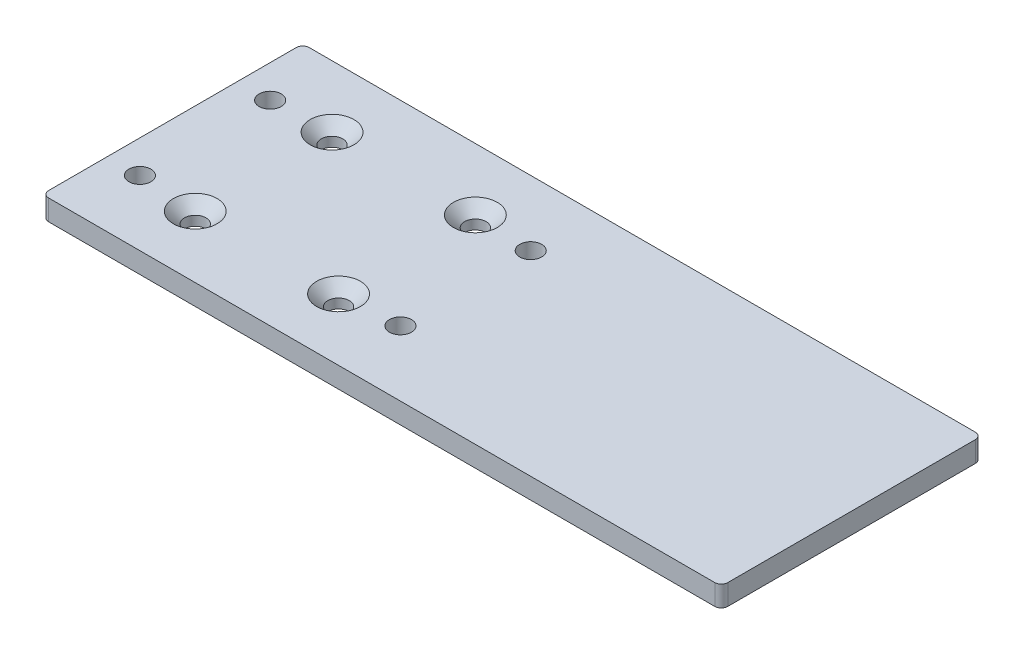
ISO-10303-21;
HEADER;
FILE_DESCRIPTION(('STEP AP214'),'2;1');
FILE_NAME('part.step','',(''),(''),'','','');
FILE_SCHEMA(('AUTOMOTIVE_DESIGN { 1 0 10303 214 1 1 1 1 }'));
ENDSEC;
DATA;
#1=APPLICATION_CONTEXT('core data for automotive mechanical design processes');
#2=APPLICATION_PROTOCOL_DEFINITION('international standard','automotive_design',2000,#1);
#3=PRODUCT_CONTEXT('',#1,'mechanical');
#4=PRODUCT('Part','Part','',(#3));
#5=PRODUCT_RELATED_PRODUCT_CATEGORY('part','',(#4));
#6=PRODUCT_DEFINITION_FORMATION('','',#4);
#7=PRODUCT_DEFINITION_CONTEXT('part definition',#1,'design');
#8=PRODUCT_DEFINITION('design','',#6,#7);
#9=PRODUCT_DEFINITION_SHAPE('','',#8);
#10=(LENGTH_UNIT() NAMED_UNIT(*) SI_UNIT(.MILLI.,.METRE.));
#11=(NAMED_UNIT(*) PLANE_ANGLE_UNIT() SI_UNIT($,.RADIAN.));
#12=(NAMED_UNIT(*) SI_UNIT($,.STERADIAN.) SOLID_ANGLE_UNIT());
#13=UNCERTAINTY_MEASURE_WITH_UNIT(LENGTH_MEASURE(1.E-05),#10,'distance_accuracy_value','');
#14=(GEOMETRIC_REPRESENTATION_CONTEXT(3) GLOBAL_UNCERTAINTY_ASSIGNED_CONTEXT((#13)) GLOBAL_UNIT_ASSIGNED_CONTEXT((#10,
#11,#12)) REPRESENTATION_CONTEXT('',''));
#15=CARTESIAN_POINT('',(0.,0.,0.));
#16=DIRECTION('',(0.,0.,1.));
#17=DIRECTION('',(1.,0.,0.));
#18=AXIS2_PLACEMENT_3D('',#15,#16,#17);
#19=CARTESIAN_POINT('',(-149.777777777778,-6.35,-34.4444444444445));
#20=DIRECTION('',(-1.,0.,0.));
#21=DIRECTION('',(0.,0.,1.));
#22=AXIS2_PLACEMENT_3D('',#19,#20,#21);
#23=PLANE('',#22);
#24=DIRECTION('',(0.,0.,1.));
#25=VECTOR('',#24,1.);
#26=CARTESIAN_POINT('',(-149.777777777778,0.,-34.4444444444445));
#27=LINE('',#26,#25);
#28=CARTESIAN_POINT('',(-149.777777777778,0.,-32.4444444444445));
#29=VERTEX_POINT('',#28);
#30=CARTESIAN_POINT('',(-149.777777777778,0.,43.5555555555555));
#31=VERTEX_POINT('',#30);
#32=EDGE_CURVE('E166',#29,#31,#27,.T.);
#33=ORIENTED_EDGE('',*,*,#32,.F.);
#34=DIRECTION('',(0.,1.,0.));
#35=VECTOR('',#34,1.);
#36=CARTESIAN_POINT('',(-149.777777777778,-6.35,-32.4444444444445));
#37=LINE('',#36,#35);
#38=CARTESIAN_POINT('',(-149.777777777778,-6.35,-32.4444444444445));
#39=VERTEX_POINT('',#38);
#40=EDGE_CURVE('E146',#29,#39,#37,.F.);
#41=ORIENTED_EDGE('',*,*,#40,.T.);
#42=DIRECTION('',(0.,0.,1.));
#43=VECTOR('',#42,1.);
#44=CARTESIAN_POINT('',(-149.777777777778,-6.35,-34.4444444444445));
#45=LINE('',#44,#43);
#46=CARTESIAN_POINT('',(-149.777777777778,-6.35,43.5555555555555));
#47=VERTEX_POINT('',#46);
#48=EDGE_CURVE('E127',#39,#47,#45,.T.);
#49=ORIENTED_EDGE('',*,*,#48,.T.);
#50=DIRECTION('',(0.,1.,0.));
#51=VECTOR('',#50,1.);
#52=CARTESIAN_POINT('',(-149.777777777778,-6.35,43.5555555555555));
#53=LINE('',#52,#51);
#54=EDGE_CURVE('E143',#47,#31,#53,.T.);
#55=ORIENTED_EDGE('',*,*,#54,.T.);
#56=EDGE_LOOP('',(#33,#41,#49,#55));
#57=FACE_BOUND('',#56,.T.);
#58=ADVANCED_FACE('F40',(#57),#23,.T.);
#59=CARTESIAN_POINT('',(-149.777777777778,-6.35,-34.4444444444445));
#60=DIRECTION('',(0.,0.,-1.));
#61=DIRECTION('',(-1.,0.,0.));
#62=AXIS2_PLACEMENT_3D('',#59,#60,#61);
#63=PLANE('',#62);
#64=DIRECTION('',(-1.,0.,0.));
#65=VECTOR('',#64,1.);
#66=CARTESIAN_POINT('',(-149.777777777778,-6.35,-34.4444444444445));
#67=LINE('',#66,#65);
#68=CARTESIAN_POINT('',(56.7222222222222,-6.35,-34.4444444444445));
#69=VERTEX_POINT('',#68);
#70=CARTESIAN_POINT('',(-147.777777777778,-6.35,-34.4444444444445));
#71=VERTEX_POINT('',#70);
#72=EDGE_CURVE('E132',#69,#71,#67,.T.);
#73=ORIENTED_EDGE('',*,*,#72,.T.);
#74=DIRECTION('',(0.,1.,0.));
#75=VECTOR('',#74,1.);
#76=CARTESIAN_POINT('',(-147.777777777778,-6.35,-34.4444444444445));
#77=LINE('',#76,#75);
#78=CARTESIAN_POINT('',(-147.777777777778,0.,-34.4444444444445));
#79=VERTEX_POINT('',#78);
#80=EDGE_CURVE('E126',#71,#79,#77,.T.);
#81=ORIENTED_EDGE('',*,*,#80,.T.);
#82=DIRECTION('',(-1.,0.,0.));
#83=VECTOR('',#82,1.);
#84=CARTESIAN_POINT('',(-149.777777777778,0.,-34.4444444444445));
#85=LINE('',#84,#83);
#86=CARTESIAN_POINT('',(56.7222222222222,0.,-34.4444444444445));
#87=VERTEX_POINT('',#86);
#88=EDGE_CURVE('E109',#87,#79,#85,.T.);
#89=ORIENTED_EDGE('',*,*,#88,.F.);
#90=DIRECTION('',(0.,1.,0.));
#91=VECTOR('',#90,1.);
#92=CARTESIAN_POINT('',(56.7222222222222,-6.35,-34.4444444444445));
#93=LINE('',#92,#91);
#94=EDGE_CURVE('E123',#87,#69,#93,.F.);
#95=ORIENTED_EDGE('',*,*,#94,.T.);
#96=EDGE_LOOP('',(#73,#81,#89,#95));
#97=FACE_BOUND('',#96,.T.);
#98=ADVANCED_FACE('F122',(#97),#63,.T.);
#99=CARTESIAN_POINT('',(58.7222222222222,-6.35,-34.4444444444445));
#100=DIRECTION('',(1.,0.,0.));
#101=DIRECTION('',(0.,0.,-1.));
#102=AXIS2_PLACEMENT_3D('',#99,#100,#101);
#103=PLANE('',#102);
#104=DIRECTION('',(0.,0.,-1.));
#105=VECTOR('',#104,1.);
#106=CARTESIAN_POINT('',(58.7222222222222,-6.35,-34.4444444444445));
#107=LINE('',#106,#105);
#108=CARTESIAN_POINT('',(58.7222222222222,-6.35,43.5555555555555));
#109=VERTEX_POINT('',#108);
#110=CARTESIAN_POINT('',(58.7222222222222,-6.35,-32.4444444444445));
#111=VERTEX_POINT('',#110);
#112=EDGE_CURVE('E136',#109,#111,#107,.T.);
#113=ORIENTED_EDGE('',*,*,#112,.T.);
#114=DIRECTION('',(0.,1.,0.));
#115=VECTOR('',#114,1.);
#116=CARTESIAN_POINT('',(58.7222222222222,-6.35,-32.4444444444445));
#117=LINE('',#116,#115);
#118=CARTESIAN_POINT('',(58.7222222222222,0.,-32.4444444444445));
#119=VERTEX_POINT('',#118);
#120=EDGE_CURVE('E156',#111,#119,#117,.T.);
#121=ORIENTED_EDGE('',*,*,#120,.T.);
#122=DIRECTION('',(0.,0.,-1.));
#123=VECTOR('',#122,1.);
#124=CARTESIAN_POINT('',(58.7222222222222,0.,-34.4444444444445));
#125=LINE('',#124,#123);
#126=CARTESIAN_POINT('',(58.7222222222222,0.,43.5555555555555));
#127=VERTEX_POINT('',#126);
#128=EDGE_CURVE('E111',#127,#119,#125,.T.);
#129=ORIENTED_EDGE('',*,*,#128,.F.);
#130=DIRECTION('',(0.,1.,0.));
#131=VECTOR('',#130,1.);
#132=CARTESIAN_POINT('',(58.7222222222222,-6.35,43.5555555555555));
#133=LINE('',#132,#131);
#134=EDGE_CURVE('E154',#127,#109,#133,.F.);
#135=ORIENTED_EDGE('',*,*,#134,.T.);
#136=EDGE_LOOP('',(#113,#121,#129,#135));
#137=FACE_BOUND('',#136,.T.);
#138=ADVANCED_FACE('F159',(#137),#103,.T.);
#139=CARTESIAN_POINT('',(-149.777777777778,-6.35,45.5555555555555));
#140=DIRECTION('',(0.,0.,1.));
#141=DIRECTION('',(1.,0.,0.));
#142=AXIS2_PLACEMENT_3D('',#139,#140,#141);
#143=PLANE('',#142);
#144=DIRECTION('',(1.,0.,0.));
#145=VECTOR('',#144,1.);
#146=CARTESIAN_POINT('',(-149.777777777778,-6.35,45.5555555555555));
#147=LINE('',#146,#145);
#148=CARTESIAN_POINT('',(-147.777777777778,-6.35,45.5555555555555));
#149=VERTEX_POINT('',#148);
#150=CARTESIAN_POINT('',(56.7222222222222,-6.35,45.5555555555555));
#151=VERTEX_POINT('',#150);
#152=EDGE_CURVE('E161',#149,#151,#147,.T.);
#153=ORIENTED_EDGE('',*,*,#152,.T.);
#154=DIRECTION('',(0.,1.,0.));
#155=VECTOR('',#154,1.);
#156=CARTESIAN_POINT('',(56.7222222222222,-6.35,45.5555555555555));
#157=LINE('',#156,#155);
#158=CARTESIAN_POINT('',(56.7222222222222,0.,45.5555555555555));
#159=VERTEX_POINT('',#158);
#160=EDGE_CURVE('E11',#151,#159,#157,.T.);
#161=ORIENTED_EDGE('',*,*,#160,.T.);
#162=DIRECTION('',(1.,0.,0.));
#163=VECTOR('',#162,1.);
#164=CARTESIAN_POINT('',(-149.777777777778,0.,45.5555555555555));
#165=LINE('',#164,#163);
#166=CARTESIAN_POINT('',(-147.777777777778,0.,45.5555555555555));
#167=VERTEX_POINT('',#166);
#168=EDGE_CURVE('E169',#167,#159,#165,.T.);
#169=ORIENTED_EDGE('',*,*,#168,.F.);
#170=DIRECTION('',(0.,1.,0.));
#171=VECTOR('',#170,1.);
#172=CARTESIAN_POINT('',(-147.777777777778,-6.35,45.5555555555555));
#173=LINE('',#172,#171);
#174=EDGE_CURVE('E48',#167,#149,#173,.F.);
#175=ORIENTED_EDGE('',*,*,#174,.T.);
#176=EDGE_LOOP('',(#153,#161,#169,#175));
#177=FACE_BOUND('',#176,.T.);
#178=ADVANCED_FACE('F172',(#177),#143,.T.);
#179=CARTESIAN_POINT('',(0.,-6.35,0.));
#180=DIRECTION('',(0.,1.,0.));
#181=DIRECTION('',(0.,0.,1.));
#182=AXIS2_PLACEMENT_3D('',#179,#180,#181);
#183=PLANE('',#182);
#184=CARTESIAN_POINT('',(-121.777777777778,-6.35,-15.4444444444444));
#185=DIRECTION('',(0.,1.,0.));
#186=DIRECTION('',(0.,0.,1.));
#187=AXIS2_PLACEMENT_3D('',#184,#185,#186);
#188=CIRCLE('',#187,3.3);
#189=CARTESIAN_POINT('',(-121.777777777778,-6.35,-12.1444444444444));
#190=VERTEX_POINT('',#189);
#191=EDGE_CURVE('E235',#190,#190,#188,.T.);
#192=ORIENTED_EDGE('',*,*,#191,.T.);
#193=EDGE_LOOP('',(#192));
#194=FACE_BOUND('',#193,.T.);
#195=CARTESIAN_POINT('',(-77.7777777777778,-6.35,-15.4444444444444));
#196=DIRECTION('',(0.,1.,0.));
#197=DIRECTION('',(0.,0.,1.));
#198=AXIS2_PLACEMENT_3D('',#195,#196,#197);
#199=CIRCLE('',#198,3.3);
#200=CARTESIAN_POINT('',(-77.7777777777778,-6.35,-12.1444444444444));
#201=VERTEX_POINT('',#200);
#202=EDGE_CURVE('E226',#201,#201,#199,.T.);
#203=ORIENTED_EDGE('',*,*,#202,.T.);
#204=EDGE_LOOP('',(#203));
#205=FACE_BOUND('',#204,.T.);
#206=CARTESIAN_POINT('',(-77.7777777777778,-6.35,26.5555555555556));
#207=DIRECTION('',(0.,1.,0.));
#208=DIRECTION('',(0.,0.,1.));
#209=AXIS2_PLACEMENT_3D('',#206,#207,#208);
#210=CIRCLE('',#209,3.3);
#211=CARTESIAN_POINT('',(-77.7777777777778,-6.35,29.8555555555556));
#212=VERTEX_POINT('',#211);
#213=EDGE_CURVE('E217',#212,#212,#210,.T.);
#214=ORIENTED_EDGE('',*,*,#213,.T.);
#215=EDGE_LOOP('',(#214));
#216=FACE_BOUND('',#215,.T.);
#217=CARTESIAN_POINT('',(-121.777777777778,-6.35,26.5555555555556));
#218=DIRECTION('',(0.,1.,0.));
#219=DIRECTION('',(0.,0.,1.));
#220=AXIS2_PLACEMENT_3D('',#217,#218,#219);
#221=CIRCLE('',#220,3.3);
#222=CARTESIAN_POINT('',(-121.777777777778,-6.35,29.8555555555556));
#223=VERTEX_POINT('',#222);
#224=EDGE_CURVE('E208',#223,#223,#221,.T.);
#225=ORIENTED_EDGE('',*,*,#224,.T.);
#226=EDGE_LOOP('',(#225));
#227=FACE_BOUND('',#226,.T.);
#228=CARTESIAN_POINT('',(-139.777777777778,-6.35,25.5555555555555));
#229=DIRECTION('',(0.,1.,0.));
#230=DIRECTION('',(0.,0.,1.));
#231=AXIS2_PLACEMENT_3D('',#228,#229,#230);
#232=CIRCLE('',#231,3.3782);
#233=CARTESIAN_POINT('',(-139.777777777778,-6.35,28.9337555555555));
#234=VERTEX_POINT('',#233);
#235=EDGE_CURVE('E202',#234,#234,#232,.T.);
#236=ORIENTED_EDGE('',*,*,#235,.T.);
#237=EDGE_LOOP('',(#236));
#238=FACE_BOUND('',#237,.T.);
#239=CARTESIAN_POINT('',(-59.7777777777778,-6.35,25.5555555555555));
#240=DIRECTION('',(0.,1.,0.));
#241=DIRECTION('',(0.,0.,1.));
#242=AXIS2_PLACEMENT_3D('',#239,#240,#241);
#243=CIRCLE('',#242,3.3782);
#244=CARTESIAN_POINT('',(-59.7777777777778,-6.35,28.9337555555555));
#245=VERTEX_POINT('',#244);
#246=EDGE_CURVE('E196',#245,#245,#243,.T.);
#247=ORIENTED_EDGE('',*,*,#246,.T.);
#248=EDGE_LOOP('',(#247));
#249=FACE_BOUND('',#248,.T.);
#250=CARTESIAN_POINT('',(-139.777777777778,-6.35,-14.4444444444445));
#251=DIRECTION('',(0.,1.,0.));
#252=DIRECTION('',(0.,0.,1.));
#253=AXIS2_PLACEMENT_3D('',#250,#251,#252);
#254=CIRCLE('',#253,3.3782);
#255=CARTESIAN_POINT('',(-139.777777777778,-6.35,-11.0662444444445));
#256=VERTEX_POINT('',#255);
#257=EDGE_CURVE('E190',#256,#256,#254,.T.);
#258=ORIENTED_EDGE('',*,*,#257,.T.);
#259=EDGE_LOOP('',(#258));
#260=FACE_BOUND('',#259,.T.);
#261=CARTESIAN_POINT('',(-59.7777777777778,-6.35,-14.4444444444445));
#262=DIRECTION('',(0.,1.,0.));
#263=DIRECTION('',(0.,0.,1.));
#264=AXIS2_PLACEMENT_3D('',#261,#262,#263);
#265=CIRCLE('',#264,3.3782);
#266=CARTESIAN_POINT('',(-59.7777777777778,-6.35,-11.0662444444445));
#267=VERTEX_POINT('',#266);
#268=EDGE_CURVE('E170',#267,#267,#265,.T.);
#269=ORIENTED_EDGE('',*,*,#268,.T.);
#270=EDGE_LOOP('',(#269));
#271=FACE_BOUND('',#270,.T.);
#272=ORIENTED_EDGE('',*,*,#48,.F.);
#273=CARTESIAN_POINT('',(-147.777777777778,-6.35,-32.4444444444445));
#274=DIRECTION('',(0.,1.,0.));
#275=DIRECTION('',(0.,0.,1.));
#276=AXIS2_PLACEMENT_3D('',#273,#274,#275);
#277=CIRCLE('',#276,2.);
#278=EDGE_CURVE('E152',#39,#71,#277,.F.);
#279=ORIENTED_EDGE('',*,*,#278,.T.);
#280=ORIENTED_EDGE('',*,*,#72,.F.);
#281=CARTESIAN_POINT('',(56.7222222222222,-6.35,-32.4444444444445));
#282=DIRECTION('',(0.,1.,0.));
#283=DIRECTION('',(0.,0.,1.));
#284=AXIS2_PLACEMENT_3D('',#281,#282,#283);
#285=CIRCLE('',#284,2.);
#286=EDGE_CURVE('E131',#69,#111,#285,.F.);
#287=ORIENTED_EDGE('',*,*,#286,.T.);
#288=ORIENTED_EDGE('',*,*,#112,.F.);
#289=CARTESIAN_POINT('',(56.7222222222222,-6.35,43.5555555555555));
#290=DIRECTION('',(0.,1.,0.));
#291=DIRECTION('',(0.,0.,1.));
#292=AXIS2_PLACEMENT_3D('',#289,#290,#291);
#293=CIRCLE('',#292,2.);
#294=EDGE_CURVE('E55',#109,#151,#293,.F.);
#295=ORIENTED_EDGE('',*,*,#294,.T.);
#296=ORIENTED_EDGE('',*,*,#152,.F.);
#297=CARTESIAN_POINT('',(-147.777777777778,-6.35,43.5555555555555));
#298=DIRECTION('',(0.,1.,0.));
#299=DIRECTION('',(0.,0.,1.));
#300=AXIS2_PLACEMENT_3D('',#297,#298,#299);
#301=CIRCLE('',#300,2.);
#302=EDGE_CURVE('E148',#149,#47,#301,.F.);
#303=ORIENTED_EDGE('',*,*,#302,.T.);
#304=EDGE_LOOP('',(#272,#279,#280,#287,#288,#295,#296,#303));
#305=FACE_BOUND('',#304,.T.);
#306=ADVANCED_FACE('F179',(#194,#205,#216,#227,#238,#249,#260,#271,#305),#183,.F.);
#307=CARTESIAN_POINT('',(0.,0.,0.));
#308=DIRECTION('',(0.,1.,0.));
#309=DIRECTION('',(0.,0.,1.));
#310=AXIS2_PLACEMENT_3D('',#307,#308,#309);
#311=PLANE('',#310);
#312=CARTESIAN_POINT('',(-121.777777777778,0.,-15.4444444444444));
#313=DIRECTION('',(0.,1.,0.));
#314=DIRECTION('',(0.,0.,1.));
#315=AXIS2_PLACEMENT_3D('',#312,#313,#314);
#316=CIRCLE('',#315,6.72);
#317=CARTESIAN_POINT('',(-121.777777777778,0.,-8.72444444444442));
#318=VERTEX_POINT('',#317);
#319=EDGE_CURVE('E241',#318,#318,#316,.T.);
#320=ORIENTED_EDGE('',*,*,#319,.F.);
#321=EDGE_LOOP('',(#320));
#322=FACE_BOUND('',#321,.T.);
#323=CARTESIAN_POINT('',(-77.7777777777778,0.,-15.4444444444444));
#324=DIRECTION('',(0.,1.,0.));
#325=DIRECTION('',(0.,0.,1.));
#326=AXIS2_PLACEMENT_3D('',#323,#324,#325);
#327=CIRCLE('',#326,6.72);
#328=CARTESIAN_POINT('',(-77.7777777777778,0.,-8.72444444444442));
#329=VERTEX_POINT('',#328);
#330=EDGE_CURVE('E232',#329,#329,#327,.T.);
#331=ORIENTED_EDGE('',*,*,#330,.F.);
#332=EDGE_LOOP('',(#331));
#333=FACE_BOUND('',#332,.T.);
#334=CARTESIAN_POINT('',(-77.7777777777778,0.,26.5555555555556));
#335=DIRECTION('',(0.,1.,0.));
#336=DIRECTION('',(0.,0.,1.));
#337=AXIS2_PLACEMENT_3D('',#334,#335,#336);
#338=CIRCLE('',#337,6.72);
#339=CARTESIAN_POINT('',(-77.7777777777778,0.,33.2755555555556));
#340=VERTEX_POINT('',#339);
#341=EDGE_CURVE('E223',#340,#340,#338,.T.);
#342=ORIENTED_EDGE('',*,*,#341,.F.);
#343=EDGE_LOOP('',(#342));
#344=FACE_BOUND('',#343,.T.);
#345=CARTESIAN_POINT('',(-121.777777777778,0.,26.5555555555556));
#346=DIRECTION('',(0.,1.,0.));
#347=DIRECTION('',(0.,0.,1.));
#348=AXIS2_PLACEMENT_3D('',#345,#346,#347);
#349=CIRCLE('',#348,6.72);
#350=CARTESIAN_POINT('',(-121.777777777778,0.,33.2755555555556));
#351=VERTEX_POINT('',#350);
#352=EDGE_CURVE('E214',#351,#351,#349,.T.);
#353=ORIENTED_EDGE('',*,*,#352,.F.);
#354=EDGE_LOOP('',(#353));
#355=FACE_BOUND('',#354,.T.);
#356=CARTESIAN_POINT('',(-139.777777777778,0.,25.5555555555555));
#357=DIRECTION('',(0.,1.,0.));
#358=DIRECTION('',(0.,0.,1.));
#359=AXIS2_PLACEMENT_3D('',#356,#357,#358);
#360=CIRCLE('',#359,3.3782);
#361=CARTESIAN_POINT('',(-139.777777777778,0.,28.9337555555555));
#362=VERTEX_POINT('',#361);
#363=EDGE_CURVE('E205',#362,#362,#360,.T.);
#364=ORIENTED_EDGE('',*,*,#363,.F.);
#365=EDGE_LOOP('',(#364));
#366=FACE_BOUND('',#365,.T.);
#367=CARTESIAN_POINT('',(-59.7777777777778,0.,25.5555555555555));
#368=DIRECTION('',(0.,1.,0.));
#369=DIRECTION('',(0.,0.,1.));
#370=AXIS2_PLACEMENT_3D('',#367,#368,#369);
#371=CIRCLE('',#370,3.3782);
#372=CARTESIAN_POINT('',(-59.7777777777778,0.,28.9337555555555));
#373=VERTEX_POINT('',#372);
#374=EDGE_CURVE('E199',#373,#373,#371,.T.);
#375=ORIENTED_EDGE('',*,*,#374,.F.);
#376=EDGE_LOOP('',(#375));
#377=FACE_BOUND('',#376,.T.);
#378=CARTESIAN_POINT('',(-139.777777777778,0.,-14.4444444444445));
#379=DIRECTION('',(0.,1.,0.));
#380=DIRECTION('',(0.,0.,1.));
#381=AXIS2_PLACEMENT_3D('',#378,#379,#380);
#382=CIRCLE('',#381,3.3782);
#383=CARTESIAN_POINT('',(-139.777777777778,0.,-11.0662444444445));
#384=VERTEX_POINT('',#383);
#385=EDGE_CURVE('E193',#384,#384,#382,.T.);
#386=ORIENTED_EDGE('',*,*,#385,.F.);
#387=EDGE_LOOP('',(#386));
#388=FACE_BOUND('',#387,.T.);
#389=CARTESIAN_POINT('',(-59.7777777777778,0.,-14.4444444444445));
#390=DIRECTION('',(0.,1.,0.));
#391=DIRECTION('',(0.,0.,1.));
#392=AXIS2_PLACEMENT_3D('',#389,#390,#391);
#393=CIRCLE('',#392,3.3782);
#394=CARTESIAN_POINT('',(-59.7777777777778,0.,-11.0662444444445));
#395=VERTEX_POINT('',#394);
#396=EDGE_CURVE('E187',#395,#395,#393,.T.);
#397=ORIENTED_EDGE('',*,*,#396,.F.);
#398=EDGE_LOOP('',(#397));
#399=FACE_BOUND('',#398,.T.);
#400=ORIENTED_EDGE('',*,*,#88,.T.);
#401=CARTESIAN_POINT('',(-147.777777777778,0.,-32.4444444444445));
#402=DIRECTION('',(0.,1.,0.));
#403=DIRECTION('',(0.,0.,1.));
#404=AXIS2_PLACEMENT_3D('',#401,#402,#403);
#405=CIRCLE('',#404,2.);
#406=EDGE_CURVE('E116',#79,#29,#405,.T.);
#407=ORIENTED_EDGE('',*,*,#406,.T.);
#408=ORIENTED_EDGE('',*,*,#32,.T.);
#409=CARTESIAN_POINT('',(-147.777777777778,0.,43.5555555555555));
#410=DIRECTION('',(0.,1.,0.));
#411=DIRECTION('',(0.,0.,1.));
#412=AXIS2_PLACEMENT_3D('',#409,#410,#411);
#413=CIRCLE('',#412,2.);
#414=EDGE_CURVE('E134',#31,#167,#413,.T.);
#415=ORIENTED_EDGE('',*,*,#414,.T.);
#416=ORIENTED_EDGE('',*,*,#168,.T.);
#417=CARTESIAN_POINT('',(56.7222222222222,0.,43.5555555555555));
#418=DIRECTION('',(0.,1.,0.));
#419=DIRECTION('',(0.,0.,1.));
#420=AXIS2_PLACEMENT_3D('',#417,#418,#419);
#421=CIRCLE('',#420,2.);
#422=EDGE_CURVE('E117',#159,#127,#421,.T.);
#423=ORIENTED_EDGE('',*,*,#422,.T.);
#424=ORIENTED_EDGE('',*,*,#128,.T.);
#425=CARTESIAN_POINT('',(56.7222222222222,0.,-32.4444444444445));
#426=DIRECTION('',(0.,1.,0.));
#427=DIRECTION('',(0.,0.,1.));
#428=AXIS2_PLACEMENT_3D('',#425,#426,#427);
#429=CIRCLE('',#428,2.);
#430=EDGE_CURVE('E106',#119,#87,#429,.T.);
#431=ORIENTED_EDGE('',*,*,#430,.T.);
#432=EDGE_LOOP('',(#400,#407,#408,#415,#416,#423,#424,#431));
#433=FACE_BOUND('',#432,.T.);
#434=ADVANCED_FACE('F108',(#322,#333,#344,#355,#366,#377,#388,#399,#433),#311,.T.);
#435=CARTESIAN_POINT('',(-147.777777777778,-6.35,-32.4444444444445));
#436=DIRECTION('',(0.,1.,0.));
#437=DIRECTION('',(0.,0.,1.));
#438=AXIS2_PLACEMENT_3D('',#435,#436,#437);
#439=CYLINDRICAL_SURFACE('',#438,2.);
#440=ORIENTED_EDGE('',*,*,#278,.F.);
#441=ORIENTED_EDGE('',*,*,#40,.F.);
#442=ORIENTED_EDGE('',*,*,#406,.F.);
#443=ORIENTED_EDGE('',*,*,#80,.F.);
#444=EDGE_LOOP('',(#440,#441,#442,#443));
#445=FACE_BOUND('',#444,.T.);
#446=ADVANCED_FACE('F249',(#445),#439,.T.);
#447=CARTESIAN_POINT('',(56.7222222222222,-6.35,-32.4444444444445));
#448=DIRECTION('',(0.,1.,0.));
#449=DIRECTION('',(0.,0.,1.));
#450=AXIS2_PLACEMENT_3D('',#447,#448,#449);
#451=CYLINDRICAL_SURFACE('',#450,2.);
#452=ORIENTED_EDGE('',*,*,#286,.F.);
#453=ORIENTED_EDGE('',*,*,#94,.F.);
#454=ORIENTED_EDGE('',*,*,#430,.F.);
#455=ORIENTED_EDGE('',*,*,#120,.F.);
#456=EDGE_LOOP('',(#452,#453,#454,#455));
#457=FACE_BOUND('',#456,.T.);
#458=ADVANCED_FACE('F130',(#457),#451,.T.);
#459=CARTESIAN_POINT('',(56.7222222222222,-6.35,43.5555555555555));
#460=DIRECTION('',(0.,1.,0.));
#461=DIRECTION('',(0.,0.,1.));
#462=AXIS2_PLACEMENT_3D('',#459,#460,#461);
#463=CYLINDRICAL_SURFACE('',#462,2.);
#464=ORIENTED_EDGE('',*,*,#294,.F.);
#465=ORIENTED_EDGE('',*,*,#134,.F.);
#466=ORIENTED_EDGE('',*,*,#422,.F.);
#467=ORIENTED_EDGE('',*,*,#160,.F.);
#468=EDGE_LOOP('',(#464,#465,#466,#467));
#469=FACE_BOUND('',#468,.T.);
#470=ADVANCED_FACE('F277',(#469),#463,.T.);
#471=CARTESIAN_POINT('',(-147.777777777778,-6.35,43.5555555555555));
#472=DIRECTION('',(0.,1.,0.));
#473=DIRECTION('',(0.,0.,1.));
#474=AXIS2_PLACEMENT_3D('',#471,#472,#473);
#475=CYLINDRICAL_SURFACE('',#474,2.);
#476=ORIENTED_EDGE('',*,*,#302,.F.);
#477=ORIENTED_EDGE('',*,*,#174,.F.);
#478=ORIENTED_EDGE('',*,*,#414,.F.);
#479=ORIENTED_EDGE('',*,*,#54,.F.);
#480=EDGE_LOOP('',(#476,#477,#478,#479));
#481=FACE_BOUND('',#480,.T.);
#482=ADVANCED_FACE('F42',(#481),#475,.T.);
#483=CARTESIAN_POINT('',(-59.7777777777778,0.,-14.4444444444445));
#484=DIRECTION('',(0.,1.,0.));
#485=DIRECTION('',(0.,0.,1.));
#486=AXIS2_PLACEMENT_3D('',#483,#484,#485);
#487=CYLINDRICAL_SURFACE('',#486,3.3782);
#488=ORIENTED_EDGE('',*,*,#268,.F.);
#489=EDGE_LOOP('',(#488));
#490=FACE_BOUND('',#489,.T.);
#491=ORIENTED_EDGE('',*,*,#396,.T.);
#492=EDGE_LOOP('',(#491));
#493=FACE_BOUND('',#492,.T.);
#494=ADVANCED_FACE('F265',(#490,#493),#487,.F.);
#495=CARTESIAN_POINT('',(-139.777777777778,0.,-14.4444444444445));
#496=DIRECTION('',(0.,1.,0.));
#497=DIRECTION('',(0.,0.,1.));
#498=AXIS2_PLACEMENT_3D('',#495,#496,#497);
#499=CYLINDRICAL_SURFACE('',#498,3.3782);
#500=ORIENTED_EDGE('',*,*,#257,.F.);
#501=EDGE_LOOP('',(#500));
#502=FACE_BOUND('',#501,.T.);
#503=ORIENTED_EDGE('',*,*,#385,.T.);
#504=EDGE_LOOP('',(#503));
#505=FACE_BOUND('',#504,.T.);
#506=ADVANCED_FACE('F267',(#502,#505),#499,.F.);
#507=CARTESIAN_POINT('',(-59.7777777777778,0.,25.5555555555555));
#508=DIRECTION('',(0.,1.,0.));
#509=DIRECTION('',(0.,0.,1.));
#510=AXIS2_PLACEMENT_3D('',#507,#508,#509);
#511=CYLINDRICAL_SURFACE('',#510,3.3782);
#512=ORIENTED_EDGE('',*,*,#246,.F.);
#513=EDGE_LOOP('',(#512));
#514=FACE_BOUND('',#513,.T.);
#515=ORIENTED_EDGE('',*,*,#374,.T.);
#516=EDGE_LOOP('',(#515));
#517=FACE_BOUND('',#516,.T.);
#518=ADVANCED_FACE('F274',(#514,#517),#511,.F.);
#519=CARTESIAN_POINT('',(-139.777777777778,0.,25.5555555555555));
#520=DIRECTION('',(0.,1.,0.));
#521=DIRECTION('',(0.,0.,1.));
#522=AXIS2_PLACEMENT_3D('',#519,#520,#521);
#523=CYLINDRICAL_SURFACE('',#522,3.3782);
#524=ORIENTED_EDGE('',*,*,#235,.F.);
#525=EDGE_LOOP('',(#524));
#526=FACE_BOUND('',#525,.T.);
#527=ORIENTED_EDGE('',*,*,#363,.T.);
#528=EDGE_LOOP('',(#527));
#529=FACE_BOUND('',#528,.T.);
#530=ADVANCED_FACE('F322',(#526,#529),#523,.F.);
#531=CARTESIAN_POINT('',(-121.777777777778,0.,26.5555555555556));
#532=DIRECTION('',(0.,1.,0.));
#533=DIRECTION('',(0.,0.,1.));
#534=AXIS2_PLACEMENT_3D('',#531,#532,#533);
#535=CYLINDRICAL_SURFACE('',#534,3.3);
#536=ORIENTED_EDGE('',*,*,#224,.F.);
#537=EDGE_LOOP('',(#536));
#538=FACE_BOUND('',#537,.T.);
#539=CARTESIAN_POINT('',(-121.777777777778,-3.42,26.5555555555556));
#540=DIRECTION('',(0.,1.,0.));
#541=DIRECTION('',(0.,0.,1.));
#542=AXIS2_PLACEMENT_3D('',#539,#540,#541);
#543=CIRCLE('',#542,3.3);
#544=CARTESIAN_POINT('',(-121.777777777778,-3.42,29.8555555555556));
#545=VERTEX_POINT('',#544);
#546=EDGE_CURVE('E211',#545,#545,#543,.T.);
#547=ORIENTED_EDGE('',*,*,#546,.T.);
#548=EDGE_LOOP('',(#547));
#549=FACE_BOUND('',#548,.T.);
#550=ADVANCED_FACE('F332',(#538,#549),#535,.F.);
#551=CARTESIAN_POINT('',(-121.777777777778,0.,26.5555555555556));
#552=DIRECTION('',(0.,1.,0.));
#553=DIRECTION('',(0.,0.,1.));
#554=AXIS2_PLACEMENT_3D('',#551,#552,#553);
#555=CONICAL_SURFACE('',#554,6.72,0.78539816339745);
#556=ORIENTED_EDGE('',*,*,#546,.F.);
#557=EDGE_LOOP('',(#556));
#558=FACE_BOUND('',#557,.T.);
#559=ORIENTED_EDGE('',*,*,#352,.T.);
#560=EDGE_LOOP('',(#559));
#561=FACE_BOUND('',#560,.T.);
#562=ADVANCED_FACE('F361',(#558,#561),#555,.F.);
#563=CARTESIAN_POINT('',(-77.7777777777778,0.,26.5555555555556));
#564=DIRECTION('',(0.,1.,0.));
#565=DIRECTION('',(0.,0.,1.));
#566=AXIS2_PLACEMENT_3D('',#563,#564,#565);
#567=CYLINDRICAL_SURFACE('',#566,3.3);
#568=ORIENTED_EDGE('',*,*,#213,.F.);
#569=EDGE_LOOP('',(#568));
#570=FACE_BOUND('',#569,.T.);
#571=CARTESIAN_POINT('',(-77.7777777777778,-3.42,26.5555555555556));
#572=DIRECTION('',(0.,1.,0.));
#573=DIRECTION('',(0.,0.,1.));
#574=AXIS2_PLACEMENT_3D('',#571,#572,#573);
#575=CIRCLE('',#574,3.3);
#576=CARTESIAN_POINT('',(-77.7777777777778,-3.42,29.8555555555556));
#577=VERTEX_POINT('',#576);
#578=EDGE_CURVE('E220',#577,#577,#575,.T.);
#579=ORIENTED_EDGE('',*,*,#578,.T.);
#580=EDGE_LOOP('',(#579));
#581=FACE_BOUND('',#580,.T.);
#582=ADVANCED_FACE('F371',(#570,#581),#567,.F.);
#583=CARTESIAN_POINT('',(-77.7777777777778,0.,26.5555555555556));
#584=DIRECTION('',(0.,1.,0.));
#585=DIRECTION('',(0.,0.,1.));
#586=AXIS2_PLACEMENT_3D('',#583,#584,#585);
#587=CONICAL_SURFACE('',#586,6.72,0.78539816339745);
#588=ORIENTED_EDGE('',*,*,#578,.F.);
#589=EDGE_LOOP('',(#588));
#590=FACE_BOUND('',#589,.T.);
#591=ORIENTED_EDGE('',*,*,#341,.T.);
#592=EDGE_LOOP('',(#591));
#593=FACE_BOUND('',#592,.T.);
#594=ADVANCED_FACE('F381',(#590,#593),#587,.F.);
#595=CARTESIAN_POINT('',(-77.7777777777778,0.,-15.4444444444444));
#596=DIRECTION('',(0.,1.,0.));
#597=DIRECTION('',(0.,0.,1.));
#598=AXIS2_PLACEMENT_3D('',#595,#596,#597);
#599=CYLINDRICAL_SURFACE('',#598,3.3);
#600=ORIENTED_EDGE('',*,*,#202,.F.);
#601=EDGE_LOOP('',(#600));
#602=FACE_BOUND('',#601,.T.);
#603=CARTESIAN_POINT('',(-77.7777777777778,-3.42,-15.4444444444444));
#604=DIRECTION('',(0.,1.,0.));
#605=DIRECTION('',(0.,0.,1.));
#606=AXIS2_PLACEMENT_3D('',#603,#604,#605);
#607=CIRCLE('',#606,3.3);
#608=CARTESIAN_POINT('',(-77.7777777777778,-3.42,-12.1444444444444));
#609=VERTEX_POINT('',#608);
#610=EDGE_CURVE('E229',#609,#609,#607,.T.);
#611=ORIENTED_EDGE('',*,*,#610,.T.);
#612=EDGE_LOOP('',(#611));
#613=FACE_BOUND('',#612,.T.);
#614=ADVANCED_FACE('F391',(#602,#613),#599,.F.);
#615=CARTESIAN_POINT('',(-77.7777777777778,0.,-15.4444444444444));
#616=DIRECTION('',(0.,1.,0.));
#617=DIRECTION('',(0.,0.,1.));
#618=AXIS2_PLACEMENT_3D('',#615,#616,#617);
#619=CONICAL_SURFACE('',#618,6.72,0.78539816339745);
#620=ORIENTED_EDGE('',*,*,#610,.F.);
#621=EDGE_LOOP('',(#620));
#622=FACE_BOUND('',#621,.T.);
#623=ORIENTED_EDGE('',*,*,#330,.T.);
#624=EDGE_LOOP('',(#623));
#625=FACE_BOUND('',#624,.T.);
#626=ADVANCED_FACE('F401',(#622,#625),#619,.F.);
#627=CARTESIAN_POINT('',(-121.777777777778,0.,-15.4444444444444));
#628=DIRECTION('',(0.,1.,0.));
#629=DIRECTION('',(0.,0.,1.));
#630=AXIS2_PLACEMENT_3D('',#627,#628,#629);
#631=CYLINDRICAL_SURFACE('',#630,3.3);
#632=ORIENTED_EDGE('',*,*,#191,.F.);
#633=EDGE_LOOP('',(#632));
#634=FACE_BOUND('',#633,.T.);
#635=CARTESIAN_POINT('',(-121.777777777778,-3.42,-15.4444444444444));
#636=DIRECTION('',(0.,1.,0.));
#637=DIRECTION('',(0.,0.,1.));
#638=AXIS2_PLACEMENT_3D('',#635,#636,#637);
#639=CIRCLE('',#638,3.3);
#640=CARTESIAN_POINT('',(-121.777777777778,-3.42,-12.1444444444444));
#641=VERTEX_POINT('',#640);
#642=EDGE_CURVE('E238',#641,#641,#639,.T.);
#643=ORIENTED_EDGE('',*,*,#642,.T.);
#644=EDGE_LOOP('',(#643));
#645=FACE_BOUND('',#644,.T.);
#646=ADVANCED_FACE('F411',(#634,#645),#631,.F.);
#647=CARTESIAN_POINT('',(-121.777777777778,0.,-15.4444444444444));
#648=DIRECTION('',(0.,1.,0.));
#649=DIRECTION('',(0.,0.,1.));
#650=AXIS2_PLACEMENT_3D('',#647,#648,#649);
#651=CONICAL_SURFACE('',#650,6.72,0.78539816339745);
#652=ORIENTED_EDGE('',*,*,#642,.F.);
#653=EDGE_LOOP('',(#652));
#654=FACE_BOUND('',#653,.T.);
#655=ORIENTED_EDGE('',*,*,#319,.T.);
#656=EDGE_LOOP('',(#655));
#657=FACE_BOUND('',#656,.T.);
#658=ADVANCED_FACE('F245',(#654,#657),#651,.F.);
#659=CLOSED_SHELL('',(#58,#98,#138,#178,#306,#434,#446,#458,#470,#482,#494,#506,#518,#530,#550,
#562,#582,#594,#614,#626,#646,#658));
#660=MANIFOLD_SOLID_BREP('B2',#659);
#661=ADVANCED_BREP_SHAPE_REPRESENTATION('',(#18,#660),#14);
#662=SHAPE_DEFINITION_REPRESENTATION(#9,#661);
ENDSEC;
END-ISO-10303-21;
